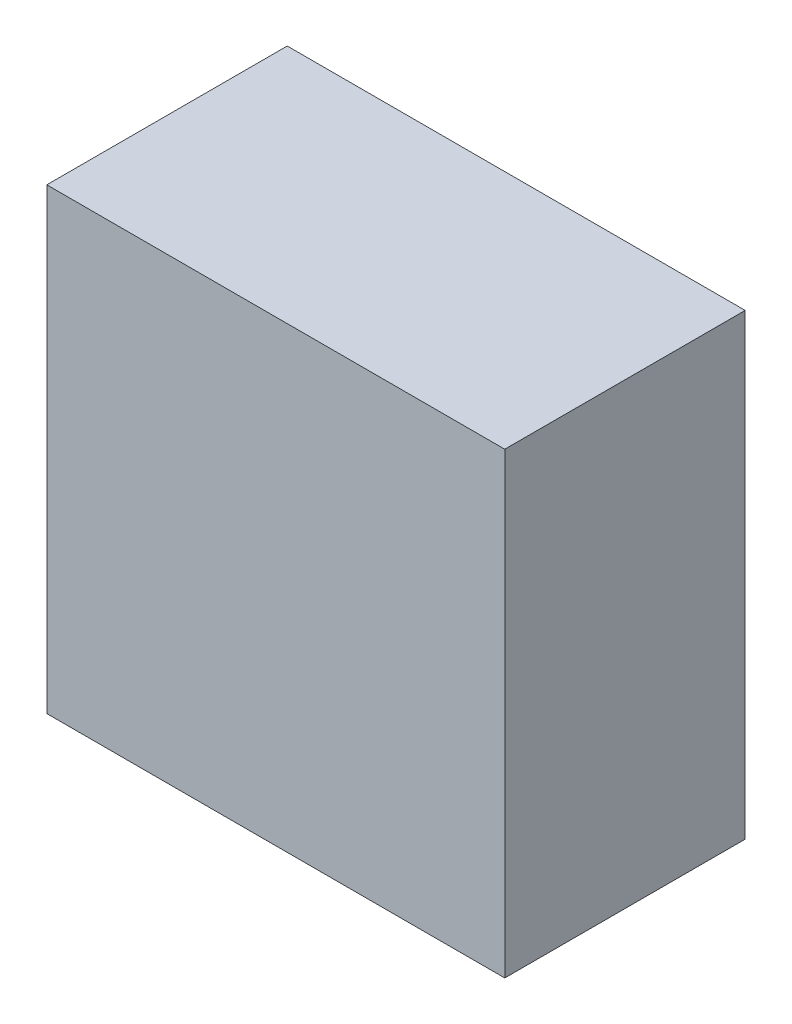
ISO-10303-21;
HEADER;
FILE_DESCRIPTION(('STEP AP214'),'2;1');
FILE_NAME('part.step','',(''),(''),'','','');
FILE_SCHEMA(('AUTOMOTIVE_DESIGN { 1 0 10303 214 1 1 1 1 }'));
ENDSEC;
DATA;
#1=APPLICATION_CONTEXT('core data for automotive mechanical design processes');
#2=APPLICATION_PROTOCOL_DEFINITION('international standard','automotive_design',2000,#1);
#3=PRODUCT_CONTEXT('',#1,'mechanical');
#4=PRODUCT('Part','Part','',(#3));
#5=PRODUCT_RELATED_PRODUCT_CATEGORY('part','',(#4));
#6=PRODUCT_DEFINITION_FORMATION('','',#4);
#7=PRODUCT_DEFINITION_CONTEXT('part definition',#1,'design');
#8=PRODUCT_DEFINITION('design','',#6,#7);
#9=PRODUCT_DEFINITION_SHAPE('','',#8);
#10=(LENGTH_UNIT() NAMED_UNIT(*) SI_UNIT(.MILLI.,.METRE.));
#11=(NAMED_UNIT(*) PLANE_ANGLE_UNIT() SI_UNIT($,.RADIAN.));
#12=(NAMED_UNIT(*) SI_UNIT($,.STERADIAN.) SOLID_ANGLE_UNIT());
#13=UNCERTAINTY_MEASURE_WITH_UNIT(LENGTH_MEASURE(1.E-05),#10,'distance_accuracy_value','');
#14=(GEOMETRIC_REPRESENTATION_CONTEXT(3) GLOBAL_UNCERTAINTY_ASSIGNED_CONTEXT((#13)) GLOBAL_UNIT_ASSIGNED_CONTEXT((#10,
#11,#12)) REPRESENTATION_CONTEXT('',''));
#15=CARTESIAN_POINT('',(0.,0.,0.));
#16=DIRECTION('',(0.,0.,1.));
#17=DIRECTION('',(1.,0.,0.));
#18=AXIS2_PLACEMENT_3D('',#15,#16,#17);
#19=CARTESIAN_POINT('',(-3.99999966769952,3.99999957230048,0.));
#20=DIRECTION('',(1.,1.19248806385031E-08,0.));
#21=DIRECTION('',(1.19248806385031E-08,-1.,0.));
#22=AXIS2_PLACEMENT_3D('',#19,#20,#21);
#23=PLANE('',#22);
#24=DIRECTION('',(1.19248806385031E-08,-1.,0.));
#25=VECTOR('',#24,1.);
#26=CARTESIAN_POINT('',(-3.99999966769952,3.99999957230048,0.));
#27=LINE('',#26,#25);
#28=CARTESIAN_POINT('',(-3.99999966769952,3.99999957230048,0.));
#29=VERTEX_POINT('',#28);
#30=CARTESIAN_POINT('',(-3.99999957230048,-3.99999966769952,0.));
#31=VERTEX_POINT('',#30);
#32=EDGE_CURVE('E11',#29,#31,#27,.T.);
#33=ORIENTED_EDGE('',*,*,#32,.T.);
#34=DIRECTION('',(0.,0.,1.));
#35=VECTOR('',#34,1.);
#36=CARTESIAN_POINT('',(-3.99999957230048,-3.99999966769952,0.));
#37=LINE('',#36,#35);
#38=CARTESIAN_POINT('',(-3.99999957230048,-3.99999966769952,4.19999922));
#39=VERTEX_POINT('',#38);
#40=EDGE_CURVE('E24',#31,#39,#37,.T.);
#41=ORIENTED_EDGE('',*,*,#40,.T.);
#42=DIRECTION('',(1.19248806385031E-08,-1.,0.));
#43=VECTOR('',#42,1.);
#44=CARTESIAN_POINT('',(-3.99999966769952,3.99999957230048,4.19999922));
#45=LINE('',#44,#43);
#46=CARTESIAN_POINT('',(-3.99999966769952,3.99999957230048,4.19999922));
#47=VERTEX_POINT('',#46);
#48=EDGE_CURVE('E88',#47,#39,#45,.T.);
#49=ORIENTED_EDGE('',*,*,#48,.F.);
#50=DIRECTION('',(0.,0.,1.));
#51=VECTOR('',#50,1.);
#52=CARTESIAN_POINT('',(-3.99999966769952,3.99999957230048,0.));
#53=LINE('',#52,#51);
#54=EDGE_CURVE('E40',#29,#47,#53,.T.);
#55=ORIENTED_EDGE('',*,*,#54,.F.);
#56=EDGE_LOOP('',(#33,#41,#49,#55));
#57=FACE_BOUND('',#56,.T.);
#58=ADVANCED_FACE('F17',(#57),#23,.F.);
#59=CARTESIAN_POINT('',(-3.99999957230048,-3.99999966769952,0.));
#60=DIRECTION('',(-1.19248806385031E-08,1.,0.));
#61=DIRECTION('',(1.,1.19248806385031E-08,0.));
#62=AXIS2_PLACEMENT_3D('',#59,#60,#61);
#63=PLANE('',#62);
#64=DIRECTION('',(1.,1.19248806385031E-08,0.));
#65=VECTOR('',#64,1.);
#66=CARTESIAN_POINT('',(-3.99999957230048,-3.99999966769952,0.));
#67=LINE('',#66,#65);
#68=CARTESIAN_POINT('',(3.99999966769952,-3.99999957230048,0.));
#69=VERTEX_POINT('',#68);
#70=EDGE_CURVE('E33',#31,#69,#67,.T.);
#71=ORIENTED_EDGE('',*,*,#70,.T.);
#72=DIRECTION('',(0.,0.,1.));
#73=VECTOR('',#72,1.);
#74=CARTESIAN_POINT('',(3.99999966769952,-3.99999957230048,0.));
#75=LINE('',#74,#73);
#76=CARTESIAN_POINT('',(3.99999966769952,-3.99999957230048,4.19999922));
#77=VERTEX_POINT('',#76);
#78=EDGE_CURVE('E85',#69,#77,#75,.T.);
#79=ORIENTED_EDGE('',*,*,#78,.T.);
#80=DIRECTION('',(1.,1.19248806385031E-08,0.));
#81=VECTOR('',#80,1.);
#82=CARTESIAN_POINT('',(-3.99999957230048,-3.99999966769952,4.19999922));
#83=LINE('',#82,#81);
#84=EDGE_CURVE('E62',#39,#77,#83,.T.);
#85=ORIENTED_EDGE('',*,*,#84,.F.);
#86=ORIENTED_EDGE('',*,*,#40,.F.);
#87=EDGE_LOOP('',(#71,#79,#85,#86));
#88=FACE_BOUND('',#87,.T.);
#89=ADVANCED_FACE('F89',(#88),#63,.F.);
#90=CARTESIAN_POINT('',(3.99999966769952,-3.99999957230048,0.));
#91=DIRECTION('',(-1.,-1.19248806385031E-08,0.));
#92=DIRECTION('',(-1.19248806385031E-08,1.,0.));
#93=AXIS2_PLACEMENT_3D('',#90,#91,#92);
#94=PLANE('',#93);
#95=DIRECTION('',(-1.19248806385031E-08,1.,0.));
#96=VECTOR('',#95,1.);
#97=CARTESIAN_POINT('',(3.99999966769952,-3.99999957230048,0.));
#98=LINE('',#97,#96);
#99=CARTESIAN_POINT('',(3.99999957230048,3.99999966769952,0.));
#100=VERTEX_POINT('',#99);
#101=EDGE_CURVE('E75',#69,#100,#98,.T.);
#102=ORIENTED_EDGE('',*,*,#101,.T.);
#103=DIRECTION('',(0.,0.,1.));
#104=VECTOR('',#103,1.);
#105=CARTESIAN_POINT('',(3.99999957230048,3.99999966769952,0.));
#106=LINE('',#105,#104);
#107=CARTESIAN_POINT('',(3.99999957230048,3.99999966769952,4.19999922));
#108=VERTEX_POINT('',#107);
#109=EDGE_CURVE('E66',#100,#108,#106,.T.);
#110=ORIENTED_EDGE('',*,*,#109,.T.);
#111=DIRECTION('',(-1.19248806385031E-08,1.,0.));
#112=VECTOR('',#111,1.);
#113=CARTESIAN_POINT('',(3.99999966769952,-3.99999957230048,4.19999922));
#114=LINE('',#113,#112);
#115=EDGE_CURVE('E57',#77,#108,#114,.T.);
#116=ORIENTED_EDGE('',*,*,#115,.F.);
#117=ORIENTED_EDGE('',*,*,#78,.F.);
#118=EDGE_LOOP('',(#102,#110,#116,#117));
#119=FACE_BOUND('',#118,.T.);
#120=ADVANCED_FACE('F69',(#119),#94,.F.);
#121=CARTESIAN_POINT('',(3.99999957230048,3.99999966769952,0.));
#122=DIRECTION('',(1.19248806385031E-08,-1.,0.));
#123=DIRECTION('',(-1.,-1.19248806385031E-08,0.));
#124=AXIS2_PLACEMENT_3D('',#121,#122,#123);
#125=PLANE('',#124);
#126=DIRECTION('',(-1.,-1.19248806385031E-08,0.));
#127=VECTOR('',#126,1.);
#128=CARTESIAN_POINT('',(3.99999957230048,3.99999966769952,0.));
#129=LINE('',#128,#127);
#130=EDGE_CURVE('E70',#100,#29,#129,.T.);
#131=ORIENTED_EDGE('',*,*,#130,.T.);
#132=ORIENTED_EDGE('',*,*,#54,.T.);
#133=DIRECTION('',(-1.,-1.19248806385031E-08,0.));
#134=VECTOR('',#133,1.);
#135=CARTESIAN_POINT('',(3.99999957230048,3.99999966769952,4.19999922));
#136=LINE('',#135,#134);
#137=EDGE_CURVE('E58',#108,#47,#136,.T.);
#138=ORIENTED_EDGE('',*,*,#137,.F.);
#139=ORIENTED_EDGE('',*,*,#109,.F.);
#140=EDGE_LOOP('',(#131,#132,#138,#139));
#141=FACE_BOUND('',#140,.T.);
#142=ADVANCED_FACE('F76',(#141),#125,.F.);
#143=CARTESIAN_POINT('',(-3.99999966769952,3.99999957230048,0.));
#144=DIRECTION('',(0.,0.,-1.));
#145=DIRECTION('',(-1.19248806385031E-08,1.,0.));
#146=AXIS2_PLACEMENT_3D('',#143,#144,#145);
#147=PLANE('',#146);
#148=ORIENTED_EDGE('',*,*,#130,.F.);
#149=ORIENTED_EDGE('',*,*,#101,.F.);
#150=ORIENTED_EDGE('',*,*,#70,.F.);
#151=ORIENTED_EDGE('',*,*,#32,.F.);
#152=EDGE_LOOP('',(#148,#149,#150,#151));
#153=FACE_BOUND('',#152,.T.);
#154=ADVANCED_FACE('F93',(#153),#147,.T.);
#155=CARTESIAN_POINT('',(-3.99999966769952,3.99999957230048,4.19999922));
#156=DIRECTION('',(0.,0.,-1.));
#157=DIRECTION('',(-1.19248806385031E-08,1.,0.));
#158=AXIS2_PLACEMENT_3D('',#155,#156,#157);
#159=PLANE('',#158);
#160=ORIENTED_EDGE('',*,*,#48,.T.);
#161=ORIENTED_EDGE('',*,*,#84,.T.);
#162=ORIENTED_EDGE('',*,*,#115,.T.);
#163=ORIENTED_EDGE('',*,*,#137,.T.);
#164=EDGE_LOOP('',(#160,#161,#162,#163));
#165=FACE_BOUND('',#164,.T.);
#166=ADVANCED_FACE('F59',(#165),#159,.F.);
#167=CLOSED_SHELL('',(#58,#89,#120,#142,#154,#166));
#168=MANIFOLD_SOLID_BREP('B1',#167);
#169=ADVANCED_BREP_SHAPE_REPRESENTATION('',(#18,#168),#14);
#170=SHAPE_DEFINITION_REPRESENTATION(#9,#169);
ENDSEC;
END-ISO-10303-21;
